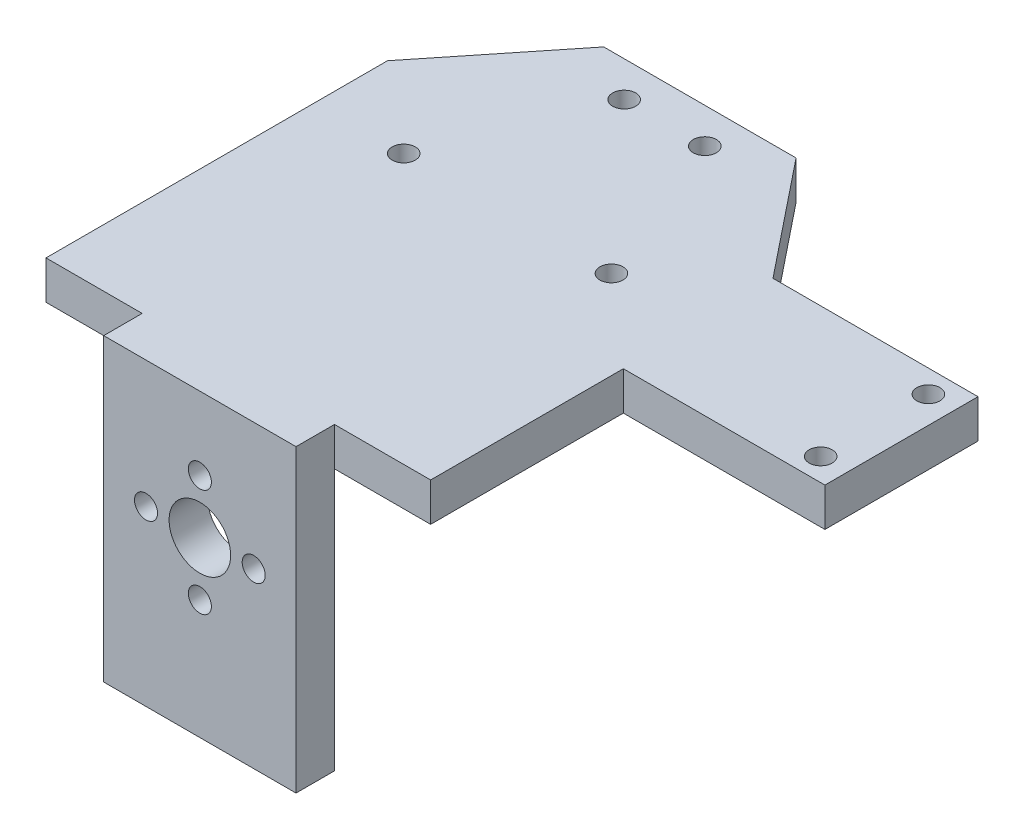
ISO-10303-21;
HEADER;
FILE_DESCRIPTION(('STEP AP214'),'2;1');
FILE_NAME('part.step','',(''),(''),'','','');
FILE_SCHEMA(('AUTOMOTIVE_DESIGN { 1 0 10303 214 1 1 1 1 }'));
ENDSEC;
DATA;
#1=APPLICATION_CONTEXT('core data for automotive mechanical design processes');
#2=APPLICATION_PROTOCOL_DEFINITION('international standard','automotive_design',2000,#1);
#3=PRODUCT_CONTEXT('',#1,'mechanical');
#4=PRODUCT('Part','Part','',(#3));
#5=PRODUCT_RELATED_PRODUCT_CATEGORY('part','',(#4));
#6=PRODUCT_DEFINITION_FORMATION('','',#4);
#7=PRODUCT_DEFINITION_CONTEXT('part definition',#1,'design');
#8=PRODUCT_DEFINITION('design','',#6,#7);
#9=PRODUCT_DEFINITION_SHAPE('','',#8);
#10=(LENGTH_UNIT() NAMED_UNIT(*) SI_UNIT(.MILLI.,.METRE.));
#11=(NAMED_UNIT(*) PLANE_ANGLE_UNIT() SI_UNIT($,.RADIAN.));
#12=(NAMED_UNIT(*) SI_UNIT($,.STERADIAN.) SOLID_ANGLE_UNIT());
#13=UNCERTAINTY_MEASURE_WITH_UNIT(LENGTH_MEASURE(1.E-05),#10,'distance_accuracy_value','');
#14=(GEOMETRIC_REPRESENTATION_CONTEXT(3) GLOBAL_UNCERTAINTY_ASSIGNED_CONTEXT((#13)) GLOBAL_UNIT_ASSIGNED_CONTEXT((#10,
#11,#12)) REPRESENTATION_CONTEXT('',''));
#15=CARTESIAN_POINT('',(0.,0.,0.));
#16=DIRECTION('',(0.,0.,1.));
#17=DIRECTION('',(1.,0.,0.));
#18=AXIS2_PLACEMENT_3D('',#15,#16,#17);
#19=CARTESIAN_POINT('',(0.,5.,30.));
#20=DIRECTION('',(0.,0.,-1.));
#21=DIRECTION('',(-1.,0.,0.));
#22=AXIS2_PLACEMENT_3D('',#19,#20,#21);
#23=PLANE('',#22);
#24=DIRECTION('',(1.,0.,0.));
#25=VECTOR('',#24,1.);
#26=CARTESIAN_POINT('',(0.,5.,30.));
#27=LINE('',#26,#25);
#28=CARTESIAN_POINT('',(12.5,5.,30.));
#29=VERTEX_POINT('',#28);
#30=CARTESIAN_POINT('',(25.,5.,30.));
#31=VERTEX_POINT('',#30);
#32=EDGE_CURVE('E128',#29,#31,#27,.T.);
#33=ORIENTED_EDGE('',*,*,#32,.F.);
#34=DIRECTION('',(0.,-1.,0.));
#35=VECTOR('',#34,1.);
#36=CARTESIAN_POINT('',(12.5,0.,30.));
#37=LINE('',#36,#35);
#38=CARTESIAN_POINT('',(12.5,0.,30.));
#39=VERTEX_POINT('',#38);
#40=EDGE_CURVE('E234',#29,#39,#37,.T.);
#41=ORIENTED_EDGE('',*,*,#40,.T.);
#42=DIRECTION('',(1.,0.,0.));
#43=VECTOR('',#42,1.);
#44=CARTESIAN_POINT('',(0.,0.,30.));
#45=LINE('',#44,#43);
#46=CARTESIAN_POINT('',(25.,0.,30.));
#47=VERTEX_POINT('',#46);
#48=EDGE_CURVE('E166',#39,#47,#45,.T.);
#49=ORIENTED_EDGE('',*,*,#48,.T.);
#50=DIRECTION('',(0.,-1.,0.));
#51=VECTOR('',#50,1.);
#52=CARTESIAN_POINT('',(25.,5.,30.));
#53=LINE('',#52,#51);
#54=EDGE_CURVE('E143',#31,#47,#53,.T.);
#55=ORIENTED_EDGE('',*,*,#54,.F.);
#56=EDGE_LOOP('',(#33,#41,#49,#55));
#57=FACE_BOUND('',#56,.T.);
#58=ADVANCED_FACE('F40',(#57),#23,.F.);
#59=CARTESIAN_POINT('',(22.2539015587463,5.,-17.8173808578109));
#60=DIRECTION('',(0.7806247497998,0.,-0.625));
#61=DIRECTION('',(-0.625,0.,-0.7806247497998));
#62=AXIS2_PLACEMENT_3D('',#59,#60,#61);
#63=PLANE('',#62);
#64=DIRECTION('',(0.,1.,0.));
#65=VECTOR('',#64,1.);
#66=CARTESIAN_POINT('',(24.5496435738328,0.,-14.95));
#67=LINE('',#66,#65);
#68=CARTESIAN_POINT('',(24.5496435738328,0.,-14.95));
#69=VERTEX_POINT('',#68);
#70=CARTESIAN_POINT('',(24.5496435738328,5.,-14.95));
#71=VERTEX_POINT('',#70);
#72=EDGE_CURVE('E181',#69,#71,#67,.T.);
#73=ORIENTED_EDGE('',*,*,#72,.F.);
#74=DIRECTION('',(0.625,0.,0.7806247497998));
#75=VECTOR('',#74,1.);
#76=CARTESIAN_POINT('',(22.2539015587463,0.,-17.8173808578109));
#77=LINE('',#76,#75);
#78=CARTESIAN_POINT('',(12.5,0.,-30.));
#79=VERTEX_POINT('',#78);
#80=EDGE_CURVE('E157',#79,#69,#77,.T.);
#81=ORIENTED_EDGE('',*,*,#80,.F.);
#82=DIRECTION('',(0.,-1.,0.));
#83=VECTOR('',#82,1.);
#84=CARTESIAN_POINT('',(12.5,5.,-30.));
#85=LINE('',#84,#83);
#86=CARTESIAN_POINT('',(12.5,5.,-30.));
#87=VERTEX_POINT('',#86);
#88=EDGE_CURVE('E44',#87,#79,#85,.T.);
#89=ORIENTED_EDGE('',*,*,#88,.F.);
#90=DIRECTION('',(0.625,0.,0.7806247497998));
#91=VECTOR('',#90,1.);
#92=CARTESIAN_POINT('',(22.2539015587463,5.,-17.8173808578109));
#93=LINE('',#92,#91);
#94=EDGE_CURVE('E136',#87,#71,#93,.T.);
#95=ORIENTED_EDGE('',*,*,#94,.T.);
#96=EDGE_LOOP('',(#73,#81,#89,#95));
#97=FACE_BOUND('',#96,.T.);
#98=ADVANCED_FACE('F178',(#97),#63,.T.);
#99=CARTESIAN_POINT('',(0.,5.,-30.));
#100=DIRECTION('',(0.,0.,-1.));
#101=DIRECTION('',(-1.,0.,0.));
#102=AXIS2_PLACEMENT_3D('',#99,#100,#101);
#103=PLANE('',#102);
#104=DIRECTION('',(1.,0.,0.));
#105=VECTOR('',#104,1.);
#106=CARTESIAN_POINT('',(0.,0.,-30.));
#107=LINE('',#106,#105);
#108=CARTESIAN_POINT('',(-12.5,0.,-30.));
#109=VERTEX_POINT('',#108);
#110=EDGE_CURVE('E160',#109,#79,#107,.T.);
#111=ORIENTED_EDGE('',*,*,#110,.F.);
#112=DIRECTION('',(0.,-1.,0.));
#113=VECTOR('',#112,1.);
#114=CARTESIAN_POINT('',(-12.5,5.,-30.));
#115=LINE('',#114,#113);
#116=CARTESIAN_POINT('',(-12.5,5.,-30.));
#117=VERTEX_POINT('',#116);
#118=EDGE_CURVE('E118',#117,#109,#115,.T.);
#119=ORIENTED_EDGE('',*,*,#118,.F.);
#120=DIRECTION('',(1.,0.,0.));
#121=VECTOR('',#120,1.);
#122=CARTESIAN_POINT('',(0.,5.,-30.));
#123=LINE('',#122,#121);
#124=EDGE_CURVE('E134',#117,#87,#123,.T.);
#125=ORIENTED_EDGE('',*,*,#124,.T.);
#126=ORIENTED_EDGE('',*,*,#88,.T.);
#127=EDGE_LOOP('',(#111,#119,#125,#126));
#128=FACE_BOUND('',#127,.T.);
#129=ADVANCED_FACE('F176',(#128),#103,.T.);
#130=CARTESIAN_POINT('',(-22.2539015587463,5.,-17.8173808578109));
#131=DIRECTION('',(-0.7806247497998,0.,-0.625));
#132=DIRECTION('',(-0.625,0.,0.7806247497998));
#133=AXIS2_PLACEMENT_3D('',#130,#131,#132);
#134=PLANE('',#133);
#135=DIRECTION('',(0.625,0.,-0.7806247497998));
#136=VECTOR('',#135,1.);
#137=CARTESIAN_POINT('',(-22.2539015587463,0.,-17.8173808578109));
#138=LINE('',#137,#136);
#139=CARTESIAN_POINT('',(-25.,0.,-14.387505004004));
#140=VERTEX_POINT('',#139);
#141=EDGE_CURVE('E114',#140,#109,#138,.T.);
#142=ORIENTED_EDGE('',*,*,#141,.F.);
#143=DIRECTION('',(0.,-1.,0.));
#144=VECTOR('',#143,1.);
#145=CARTESIAN_POINT('',(-25.,5.,-14.387505004004));
#146=LINE('',#145,#144);
#147=CARTESIAN_POINT('',(-25.,5.,-14.387505004004));
#148=VERTEX_POINT('',#147);
#149=EDGE_CURVE('E108',#148,#140,#146,.T.);
#150=ORIENTED_EDGE('',*,*,#149,.F.);
#151=DIRECTION('',(0.625,0.,-0.7806247497998));
#152=VECTOR('',#151,1.);
#153=CARTESIAN_POINT('',(-22.2539015587463,5.,-17.8173808578109));
#154=LINE('',#153,#152);
#155=EDGE_CURVE('E112',#148,#117,#154,.T.);
#156=ORIENTED_EDGE('',*,*,#155,.T.);
#157=ORIENTED_EDGE('',*,*,#118,.T.);
#158=EDGE_LOOP('',(#142,#150,#156,#157));
#159=FACE_BOUND('',#158,.T.);
#160=ADVANCED_FACE('F110',(#159),#134,.T.);
#161=CARTESIAN_POINT('',(-25.,5.,0.));
#162=DIRECTION('',(1.,0.,0.));
#163=DIRECTION('',(0.,0.,-1.));
#164=AXIS2_PLACEMENT_3D('',#161,#162,#163);
#165=PLANE('',#164);
#166=DIRECTION('',(0.,0.,1.));
#167=VECTOR('',#166,1.);
#168=CARTESIAN_POINT('',(-25.,0.,0.));
#169=LINE('',#168,#167);
#170=CARTESIAN_POINT('',(-25.,0.,30.));
#171=VERTEX_POINT('',#170);
#172=EDGE_CURVE('E164',#140,#171,#169,.T.);
#173=ORIENTED_EDGE('',*,*,#172,.T.);
#174=DIRECTION('',(0.,-1.,0.));
#175=VECTOR('',#174,1.);
#176=CARTESIAN_POINT('',(-25.,5.,30.));
#177=LINE('',#176,#175);
#178=CARTESIAN_POINT('',(-25.,5.,30.));
#179=VERTEX_POINT('',#178);
#180=EDGE_CURVE('E119',#179,#171,#177,.T.);
#181=ORIENTED_EDGE('',*,*,#180,.F.);
#182=DIRECTION('',(0.,0.,1.));
#183=VECTOR('',#182,1.);
#184=CARTESIAN_POINT('',(-25.,5.,0.));
#185=LINE('',#184,#183);
#186=EDGE_CURVE('E123',#148,#179,#185,.T.);
#187=ORIENTED_EDGE('',*,*,#186,.F.);
#188=ORIENTED_EDGE('',*,*,#149,.T.);
#189=EDGE_LOOP('',(#173,#181,#187,#188));
#190=FACE_BOUND('',#189,.T.);
#191=ADVANCED_FACE('F124',(#190),#165,.F.);
#192=CARTESIAN_POINT('',(-12.5,0.,30.));
#193=VERTEX_POINT('',#192);
#194=EDGE_CURVE('E167',#171,#193,#45,.T.);
#195=ORIENTED_EDGE('',*,*,#194,.T.);
#196=DIRECTION('',(0.,1.,0.));
#197=VECTOR('',#196,1.);
#198=CARTESIAN_POINT('',(-12.5,0.,30.));
#199=LINE('',#198,#197);
#200=CARTESIAN_POINT('',(-12.5,5.,30.));
#201=VERTEX_POINT('',#200);
#202=EDGE_CURVE('E11',#193,#201,#199,.T.);
#203=ORIENTED_EDGE('',*,*,#202,.T.);
#204=EDGE_CURVE('E140',#179,#201,#27,.T.);
#205=ORIENTED_EDGE('',*,*,#204,.F.);
#206=ORIENTED_EDGE('',*,*,#180,.T.);
#207=EDGE_LOOP('',(#195,#203,#205,#206));
#208=FACE_BOUND('',#207,.T.);
#209=ADVANCED_FACE('F188',(#208),#23,.F.);
#210=CARTESIAN_POINT('',(-13.5,5.,-5.00000000000001));
#211=DIRECTION('',(0.,-1.,0.));
#212=DIRECTION('',(0.,0.,-1.));
#213=AXIS2_PLACEMENT_3D('',#210,#211,#212);
#214=CYLINDRICAL_SURFACE('',#213,1.5);
#215=CARTESIAN_POINT('',(-13.5,5.,-5.00000000000001));
#216=DIRECTION('',(0.,1.,0.));
#217=DIRECTION('',(0.,0.,1.));
#218=AXIS2_PLACEMENT_3D('',#215,#216,#217);
#219=CIRCLE('',#218,1.5);
#220=CARTESIAN_POINT('',(-13.5,5.,-3.50000000000001));
#221=VERTEX_POINT('',#220);
#222=EDGE_CURVE('E254',#221,#221,#219,.T.);
#223=ORIENTED_EDGE('',*,*,#222,.T.);
#224=EDGE_LOOP('',(#223));
#225=FACE_BOUND('',#224,.T.);
#226=CARTESIAN_POINT('',(-13.5,0.,-5.00000000000001));
#227=DIRECTION('',(0.,1.,0.));
#228=DIRECTION('',(0.,0.,1.));
#229=AXIS2_PLACEMENT_3D('',#226,#227,#228);
#230=CIRCLE('',#229,1.5);
#231=CARTESIAN_POINT('',(-13.5,0.,-3.50000000000001));
#232=VERTEX_POINT('',#231);
#233=EDGE_CURVE('E154',#232,#232,#230,.T.);
#234=ORIENTED_EDGE('',*,*,#233,.F.);
#235=EDGE_LOOP('',(#234));
#236=FACE_BOUND('',#235,.T.);
#237=ADVANCED_FACE('F357',(#225,#236),#214,.F.);
#238=CARTESIAN_POINT('',(13.5,5.,-5.00000000000002));
#239=DIRECTION('',(0.,-1.,0.));
#240=DIRECTION('',(0.,0.,-1.));
#241=AXIS2_PLACEMENT_3D('',#238,#239,#240);
#242=CYLINDRICAL_SURFACE('',#241,1.5);
#243=CARTESIAN_POINT('',(13.5,5.,-5.00000000000002));
#244=DIRECTION('',(0.,1.,0.));
#245=DIRECTION('',(0.,0.,1.));
#246=AXIS2_PLACEMENT_3D('',#243,#244,#245);
#247=CIRCLE('',#246,1.5);
#248=CARTESIAN_POINT('',(13.5,5.,-3.50000000000001));
#249=VERTEX_POINT('',#248);
#250=EDGE_CURVE('E251',#249,#249,#247,.T.);
#251=ORIENTED_EDGE('',*,*,#250,.T.);
#252=EDGE_LOOP('',(#251));
#253=FACE_BOUND('',#252,.T.);
#254=CARTESIAN_POINT('',(13.5,0.,-5.00000000000002));
#255=DIRECTION('',(0.,1.,0.));
#256=DIRECTION('',(0.,0.,1.));
#257=AXIS2_PLACEMENT_3D('',#254,#255,#256);
#258=CIRCLE('',#257,1.5);
#259=CARTESIAN_POINT('',(13.5,0.,-3.50000000000001));
#260=VERTEX_POINT('',#259);
#261=EDGE_CURVE('E151',#260,#260,#258,.T.);
#262=ORIENTED_EDGE('',*,*,#261,.F.);
#263=EDGE_LOOP('',(#262));
#264=FACE_BOUND('',#263,.T.);
#265=ADVANCED_FACE('F362',(#253,#264),#242,.F.);
#266=CARTESIAN_POINT('',(-5.24,5.,-25.4));
#267=DIRECTION('',(0.,-1.,0.));
#268=DIRECTION('',(0.,0.,-1.));
#269=AXIS2_PLACEMENT_3D('',#266,#267,#268);
#270=CYLINDRICAL_SURFACE('',#269,1.5);
#271=CARTESIAN_POINT('',(-5.24,5.,-25.4));
#272=DIRECTION('',(0.,1.,0.));
#273=DIRECTION('',(0.,0.,1.));
#274=AXIS2_PLACEMENT_3D('',#271,#272,#273);
#275=CIRCLE('',#274,1.5);
#276=CARTESIAN_POINT('',(-5.24,5.,-23.9));
#277=VERTEX_POINT('',#276);
#278=EDGE_CURVE('E248',#277,#277,#275,.T.);
#279=ORIENTED_EDGE('',*,*,#278,.T.);
#280=EDGE_LOOP('',(#279));
#281=FACE_BOUND('',#280,.T.);
#282=CARTESIAN_POINT('',(-5.24,0.,-25.4));
#283=DIRECTION('',(0.,1.,0.));
#284=DIRECTION('',(0.,0.,1.));
#285=AXIS2_PLACEMENT_3D('',#282,#283,#284);
#286=CIRCLE('',#285,1.5);
#287=CARTESIAN_POINT('',(-5.24,0.,-23.9));
#288=VERTEX_POINT('',#287);
#289=EDGE_CURVE('E147',#288,#288,#286,.T.);
#290=ORIENTED_EDGE('',*,*,#289,.F.);
#291=EDGE_LOOP('',(#290));
#292=FACE_BOUND('',#291,.T.);
#293=ADVANCED_FACE('F373',(#281,#292),#270,.F.);
#294=CARTESIAN_POINT('',(5.24,5.,-25.4));
#295=DIRECTION('',(0.,-1.,0.));
#296=DIRECTION('',(0.,0.,-1.));
#297=AXIS2_PLACEMENT_3D('',#294,#295,#296);
#298=CYLINDRICAL_SURFACE('',#297,1.5);
#299=CARTESIAN_POINT('',(5.24,5.,-25.4));
#300=DIRECTION('',(0.,1.,0.));
#301=DIRECTION('',(0.,0.,1.));
#302=AXIS2_PLACEMENT_3D('',#299,#300,#301);
#303=CIRCLE('',#302,1.5);
#304=CARTESIAN_POINT('',(5.24,5.,-23.9));
#305=VERTEX_POINT('',#304);
#306=EDGE_CURVE('E172',#305,#305,#303,.T.);
#307=ORIENTED_EDGE('',*,*,#306,.T.);
#308=EDGE_LOOP('',(#307));
#309=FACE_BOUND('',#308,.T.);
#310=CARTESIAN_POINT('',(5.24,0.,-25.4));
#311=DIRECTION('',(0.,1.,0.));
#312=DIRECTION('',(0.,0.,1.));
#313=AXIS2_PLACEMENT_3D('',#310,#311,#312);
#314=CIRCLE('',#313,1.5);
#315=CARTESIAN_POINT('',(5.24,0.,-23.9));
#316=VERTEX_POINT('',#315);
#317=EDGE_CURVE('E144',#316,#316,#314,.T.);
#318=ORIENTED_EDGE('',*,*,#317,.F.);
#319=EDGE_LOOP('',(#318));
#320=FACE_BOUND('',#319,.T.);
#321=ADVANCED_FACE('F42',(#309,#320),#298,.F.);
#322=CARTESIAN_POINT('',(25.,5.,0.));
#323=DIRECTION('',(1.,0.,0.));
#324=DIRECTION('',(0.,0.,-1.));
#325=AXIS2_PLACEMENT_3D('',#322,#323,#324);
#326=PLANE('',#325);
#327=DIRECTION('',(0.,1.,0.));
#328=VECTOR('',#327,1.);
#329=CARTESIAN_POINT('',(25.,0.,4.94999999999999));
#330=LINE('',#329,#328);
#331=CARTESIAN_POINT('',(25.,0.,4.94999999999999));
#332=VERTEX_POINT('',#331);
#333=CARTESIAN_POINT('',(25.,5.,4.94999999999999));
#334=VERTEX_POINT('',#333);
#335=EDGE_CURVE('E287',#332,#334,#330,.T.);
#336=ORIENTED_EDGE('',*,*,#335,.T.);
#337=DIRECTION('',(0.,0.,1.));
#338=VECTOR('',#337,1.);
#339=CARTESIAN_POINT('',(25.,5.,0.));
#340=LINE('',#339,#338);
#341=EDGE_CURVE('E65',#334,#31,#340,.T.);
#342=ORIENTED_EDGE('',*,*,#341,.T.);
#343=ORIENTED_EDGE('',*,*,#54,.T.);
#344=DIRECTION('',(0.,0.,1.));
#345=VECTOR('',#344,1.);
#346=CARTESIAN_POINT('',(25.,0.,0.));
#347=LINE('',#346,#345);
#348=EDGE_CURVE('E91',#332,#47,#347,.T.);
#349=ORIENTED_EDGE('',*,*,#348,.F.);
#350=EDGE_LOOP('',(#336,#342,#343,#349));
#351=FACE_BOUND('',#350,.T.);
#352=ADVANCED_FACE('F380',(#351),#326,.T.);
#353=CARTESIAN_POINT('',(0.,5.,0.));
#354=DIRECTION('',(0.,1.,0.));
#355=DIRECTION('',(0.,0.,1.));
#356=AXIS2_PLACEMENT_3D('',#353,#354,#355);
#357=PLANE('',#356);
#358=ORIENTED_EDGE('',*,*,#341,.F.);
#359=DIRECTION('',(1.,0.,0.));
#360=VECTOR('',#359,1.);
#361=CARTESIAN_POINT('',(51.2,5.,4.94999999999998));
#362=LINE('',#361,#360);
#363=CARTESIAN_POINT('',(51.2,5.,4.94999999999998));
#364=VERTEX_POINT('',#363);
#365=EDGE_CURVE('E269',#334,#364,#362,.T.);
#366=ORIENTED_EDGE('',*,*,#365,.T.);
#367=DIRECTION('',(0.,0.,-1.));
#368=VECTOR('',#367,1.);
#369=CARTESIAN_POINT('',(51.2,5.,-14.95));
#370=LINE('',#369,#368);
#371=CARTESIAN_POINT('',(51.2,5.,-14.95));
#372=VERTEX_POINT('',#371);
#373=EDGE_CURVE('E266',#364,#372,#370,.T.);
#374=ORIENTED_EDGE('',*,*,#373,.T.);
#375=DIRECTION('',(-1.,0.,0.));
#376=VECTOR('',#375,1.);
#377=CARTESIAN_POINT('',(51.2,5.,-14.95));
#378=LINE('',#377,#376);
#379=EDGE_CURVE('E262',#372,#71,#378,.T.);
#380=ORIENTED_EDGE('',*,*,#379,.T.);
#381=ORIENTED_EDGE('',*,*,#94,.F.);
#382=ORIENTED_EDGE('',*,*,#124,.F.);
#383=ORIENTED_EDGE('',*,*,#155,.F.);
#384=ORIENTED_EDGE('',*,*,#186,.T.);
#385=ORIENTED_EDGE('',*,*,#204,.T.);
#386=DIRECTION('',(0.,0.,-1.));
#387=VECTOR('',#386,1.);
#388=CARTESIAN_POINT('',(-12.5,5.,35.));
#389=LINE('',#388,#387);
#390=CARTESIAN_POINT('',(-12.5,5.,35.));
#391=VERTEX_POINT('',#390);
#392=EDGE_CURVE('E57',#391,#201,#389,.T.);
#393=ORIENTED_EDGE('',*,*,#392,.F.);
#394=DIRECTION('',(-1.,0.,0.));
#395=VECTOR('',#394,1.);
#396=CARTESIAN_POINT('',(0.,5.,35.));
#397=LINE('',#396,#395);
#398=CARTESIAN_POINT('',(12.5,5.,35.));
#399=VERTEX_POINT('',#398);
#400=EDGE_CURVE('E194',#399,#391,#397,.T.);
#401=ORIENTED_EDGE('',*,*,#400,.F.);
#402=DIRECTION('',(0.,0.,-1.));
#403=VECTOR('',#402,1.);
#404=CARTESIAN_POINT('',(12.5,5.,35.));
#405=LINE('',#404,#403);
#406=EDGE_CURVE('E148',#399,#29,#405,.T.);
#407=ORIENTED_EDGE('',*,*,#406,.T.);
#408=ORIENTED_EDGE('',*,*,#32,.T.);
#409=EDGE_LOOP('',(#358,#366,#374,#380,#381,#382,#383,#384,#385,#393,#401,#407,#408));
#410=FACE_BOUND('',#409,.T.);
#411=ORIENTED_EDGE('',*,*,#306,.F.);
#412=EDGE_LOOP('',(#411));
#413=FACE_BOUND('',#412,.T.);
#414=ORIENTED_EDGE('',*,*,#278,.F.);
#415=EDGE_LOOP('',(#414));
#416=FACE_BOUND('',#415,.T.);
#417=ORIENTED_EDGE('',*,*,#250,.F.);
#418=EDGE_LOOP('',(#417));
#419=FACE_BOUND('',#418,.T.);
#420=ORIENTED_EDGE('',*,*,#222,.F.);
#421=EDGE_LOOP('',(#420));
#422=FACE_BOUND('',#421,.T.);
#423=CARTESIAN_POINT('',(47.7,5.,-12.));
#424=DIRECTION('',(0.,1.,0.));
#425=DIRECTION('',(0.,0.,-1.));
#426=AXIS2_PLACEMENT_3D('',#423,#424,#425);
#427=CIRCLE('',#426,1.5);
#428=CARTESIAN_POINT('',(47.7,5.,-13.5));
#429=VERTEX_POINT('',#428);
#430=EDGE_CURVE('E409',#429,#429,#427,.T.);
#431=ORIENTED_EDGE('',*,*,#430,.F.);
#432=EDGE_LOOP('',(#431));
#433=FACE_BOUND('',#432,.T.);
#434=CARTESIAN_POINT('',(47.7,5.,1.99999999999998));
#435=DIRECTION('',(0.,1.,0.));
#436=DIRECTION('',(0.,0.,1.));
#437=AXIS2_PLACEMENT_3D('',#434,#435,#436);
#438=CIRCLE('',#437,1.5);
#439=CARTESIAN_POINT('',(47.7,5.,3.49999999999998));
#440=VERTEX_POINT('',#439);
#441=EDGE_CURVE('E274',#440,#440,#438,.T.);
#442=ORIENTED_EDGE('',*,*,#441,.F.);
#443=EDGE_LOOP('',(#442));
#444=FACE_BOUND('',#443,.T.);
#445=ADVANCED_FACE('F131',(#410,#413,#416,#419,#422,#433,#444),#357,.T.);
#446=CARTESIAN_POINT('',(0.,0.,0.));
#447=DIRECTION('',(0.,1.,0.));
#448=DIRECTION('',(0.,0.,1.));
#449=AXIS2_PLACEMENT_3D('',#446,#447,#448);
#450=PLANE('',#449);
#451=DIRECTION('',(1.,0.,0.));
#452=VECTOR('',#451,1.);
#453=CARTESIAN_POINT('',(51.2,0.,4.94999999999998));
#454=LINE('',#453,#452);
#455=CARTESIAN_POINT('',(51.2,0.,4.94999999999998));
#456=VERTEX_POINT('',#455);
#457=EDGE_CURVE('E414',#332,#456,#454,.T.);
#458=ORIENTED_EDGE('',*,*,#457,.F.);
#459=ORIENTED_EDGE('',*,*,#348,.T.);
#460=ORIENTED_EDGE('',*,*,#48,.F.);
#461=EDGE_CURVE('E170',#193,#39,#45,.T.);
#462=ORIENTED_EDGE('',*,*,#461,.F.);
#463=ORIENTED_EDGE('',*,*,#194,.F.);
#464=ORIENTED_EDGE('',*,*,#172,.F.);
#465=ORIENTED_EDGE('',*,*,#141,.T.);
#466=ORIENTED_EDGE('',*,*,#110,.T.);
#467=ORIENTED_EDGE('',*,*,#80,.T.);
#468=DIRECTION('',(-1.,0.,0.));
#469=VECTOR('',#468,1.);
#470=CARTESIAN_POINT('',(51.2,0.,-14.95));
#471=LINE('',#470,#469);
#472=CARTESIAN_POINT('',(51.2,0.,-14.95));
#473=VERTEX_POINT('',#472);
#474=EDGE_CURVE('E281',#473,#69,#471,.T.);
#475=ORIENTED_EDGE('',*,*,#474,.F.);
#476=DIRECTION('',(0.,0.,-1.));
#477=VECTOR('',#476,1.);
#478=CARTESIAN_POINT('',(51.2,0.,-14.95));
#479=LINE('',#478,#477);
#480=EDGE_CURVE('E277',#456,#473,#479,.T.);
#481=ORIENTED_EDGE('',*,*,#480,.F.);
#482=EDGE_LOOP('',(#458,#459,#460,#462,#463,#464,#465,#466,#467,#475,#481));
#483=FACE_BOUND('',#482,.T.);
#484=ORIENTED_EDGE('',*,*,#317,.T.);
#485=EDGE_LOOP('',(#484));
#486=FACE_BOUND('',#485,.T.);
#487=ORIENTED_EDGE('',*,*,#289,.T.);
#488=EDGE_LOOP('',(#487));
#489=FACE_BOUND('',#488,.T.);
#490=ORIENTED_EDGE('',*,*,#261,.T.);
#491=EDGE_LOOP('',(#490));
#492=FACE_BOUND('',#491,.T.);
#493=ORIENTED_EDGE('',*,*,#233,.T.);
#494=EDGE_LOOP('',(#493));
#495=FACE_BOUND('',#494,.T.);
#496=CARTESIAN_POINT('',(47.7,0.,-12.));
#497=DIRECTION('',(0.,1.,0.));
#498=DIRECTION('',(0.,0.,-1.));
#499=AXIS2_PLACEMENT_3D('',#496,#497,#498);
#500=CIRCLE('',#499,1.5);
#501=CARTESIAN_POINT('',(47.7,0.,-13.5));
#502=VERTEX_POINT('',#501);
#503=EDGE_CURVE('E396',#502,#502,#500,.T.);
#504=ORIENTED_EDGE('',*,*,#503,.T.);
#505=EDGE_LOOP('',(#504));
#506=FACE_BOUND('',#505,.T.);
#507=CARTESIAN_POINT('',(47.7,0.,1.99999999999998));
#508=DIRECTION('',(0.,1.,0.));
#509=DIRECTION('',(0.,0.,1.));
#510=AXIS2_PLACEMENT_3D('',#507,#508,#509);
#511=CIRCLE('',#510,1.5);
#512=CARTESIAN_POINT('',(47.7,0.,3.49999999999998));
#513=VERTEX_POINT('',#512);
#514=EDGE_CURVE('E270',#513,#513,#511,.T.);
#515=ORIENTED_EDGE('',*,*,#514,.T.);
#516=EDGE_LOOP('',(#515));
#517=FACE_BOUND('',#516,.T.);
#518=ADVANCED_FACE('F183',(#483,#486,#489,#492,#495,#506,#517),#450,.F.);
#519=CARTESIAN_POINT('',(0.,0.,30.));
#520=DIRECTION('',(0.,0.,1.));
#521=DIRECTION('',(1.,0.,0.));
#522=AXIS2_PLACEMENT_3D('',#519,#520,#521);
#523=PLANE('',#522);
#524=CARTESIAN_POINT('',(-6.9999999999999,-11.5,30.));
#525=DIRECTION('',(0.,0.,1.));
#526=DIRECTION('',(1.,0.,0.));
#527=AXIS2_PLACEMENT_3D('',#524,#525,#526);
#528=CIRCLE('',#527,1.5);
#529=CARTESIAN_POINT('',(-5.4999999999999,-11.5,30.));
#530=VERTEX_POINT('',#529);
#531=EDGE_CURVE('E217',#530,#530,#528,.T.);
#532=ORIENTED_EDGE('',*,*,#531,.T.);
#533=EDGE_LOOP('',(#532));
#534=FACE_BOUND('',#533,.T.);
#535=CARTESIAN_POINT('',(1.5081679866602E-13,-18.5,30.));
#536=DIRECTION('',(0.,0.,1.));
#537=DIRECTION('',(1.,0.,0.));
#538=AXIS2_PLACEMENT_3D('',#535,#536,#537);
#539=CIRCLE('',#538,1.5);
#540=CARTESIAN_POINT('',(1.50000000000015,-18.5,30.));
#541=VERTEX_POINT('',#540);
#542=EDGE_CURVE('E220',#541,#541,#539,.T.);
#543=ORIENTED_EDGE('',*,*,#542,.T.);
#544=EDGE_LOOP('',(#543));
#545=FACE_BOUND('',#544,.T.);
#546=CARTESIAN_POINT('',(7.0000000000001,-11.4999999999999,30.));
#547=DIRECTION('',(0.,0.,1.));
#548=DIRECTION('',(1.,0.,0.));
#549=AXIS2_PLACEMENT_3D('',#546,#547,#548);
#550=CIRCLE('',#549,1.5);
#551=CARTESIAN_POINT('',(8.5000000000001,-11.4999999999999,30.));
#552=VERTEX_POINT('',#551);
#553=EDGE_CURVE('E224',#552,#552,#550,.T.);
#554=ORIENTED_EDGE('',*,*,#553,.T.);
#555=EDGE_LOOP('',(#554));
#556=FACE_BOUND('',#555,.T.);
#557=CARTESIAN_POINT('',(0.,-11.5,30.));
#558=DIRECTION('',(0.,0.,1.));
#559=DIRECTION('',(1.,0.,0.));
#560=AXIS2_PLACEMENT_3D('',#557,#558,#559);
#561=CIRCLE('',#560,4.);
#562=CARTESIAN_POINT('',(4.,-11.5,30.));
#563=VERTEX_POINT('',#562);
#564=EDGE_CURVE('E227',#563,#563,#561,.T.);
#565=ORIENTED_EDGE('',*,*,#564,.T.);
#566=EDGE_LOOP('',(#565));
#567=FACE_BOUND('',#566,.T.);
#568=CARTESIAN_POINT('',(0.,-4.5,30.));
#569=DIRECTION('',(0.,0.,1.));
#570=DIRECTION('',(1.,0.,0.));
#571=AXIS2_PLACEMENT_3D('',#568,#569,#570);
#572=CIRCLE('',#571,1.5);
#573=CARTESIAN_POINT('',(1.5,-4.5,30.));
#574=VERTEX_POINT('',#573);
#575=EDGE_CURVE('E230',#574,#574,#572,.T.);
#576=ORIENTED_EDGE('',*,*,#575,.T.);
#577=EDGE_LOOP('',(#576));
#578=FACE_BOUND('',#577,.T.);
#579=CARTESIAN_POINT('',(-12.5,-34.,30.));
#580=VERTEX_POINT('',#579);
#581=EDGE_CURVE('E50',#580,#193,#199,.T.);
#582=ORIENTED_EDGE('',*,*,#581,.T.);
#583=ORIENTED_EDGE('',*,*,#461,.T.);
#584=CARTESIAN_POINT('',(12.5,-34.,30.));
#585=VERTEX_POINT('',#584);
#586=EDGE_CURVE('E233',#39,#585,#37,.T.);
#587=ORIENTED_EDGE('',*,*,#586,.T.);
#588=DIRECTION('',(1.,0.,0.));
#589=VECTOR('',#588,1.);
#590=CARTESIAN_POINT('',(0.,-34.,30.));
#591=LINE('',#590,#589);
#592=EDGE_CURVE('E238',#580,#585,#591,.T.);
#593=ORIENTED_EDGE('',*,*,#592,.F.);
#594=EDGE_LOOP('',(#582,#583,#587,#593));
#595=FACE_BOUND('',#594,.T.);
#596=ADVANCED_FACE('F328',(#534,#545,#556,#567,#578,#595),#523,.F.);
#597=CARTESIAN_POINT('',(12.5,0.,35.));
#598=DIRECTION('',(1.,0.,0.));
#599=DIRECTION('',(0.,1.,0.));
#600=AXIS2_PLACEMENT_3D('',#597,#598,#599);
#601=PLANE('',#600);
#602=ORIENTED_EDGE('',*,*,#40,.F.);
#603=ORIENTED_EDGE('',*,*,#406,.F.);
#604=DIRECTION('',(0.,-1.,0.));
#605=VECTOR('',#604,1.);
#606=CARTESIAN_POINT('',(12.5,0.,35.));
#607=LINE('',#606,#605);
#608=CARTESIAN_POINT('',(12.5,-34.,35.));
#609=VERTEX_POINT('',#608);
#610=EDGE_CURVE('E213',#399,#609,#607,.T.);
#611=ORIENTED_EDGE('',*,*,#610,.T.);
#612=DIRECTION('',(0.,0.,-1.));
#613=VECTOR('',#612,1.);
#614=CARTESIAN_POINT('',(12.5,-34.,35.));
#615=LINE('',#614,#613);
#616=EDGE_CURVE('E211',#609,#585,#615,.T.);
#617=ORIENTED_EDGE('',*,*,#616,.T.);
#618=ORIENTED_EDGE('',*,*,#586,.F.);
#619=EDGE_LOOP('',(#602,#603,#611,#617,#618));
#620=FACE_BOUND('',#619,.T.);
#621=ADVANCED_FACE('F308',(#620),#601,.T.);
#622=CARTESIAN_POINT('',(-12.5,0.,35.));
#623=DIRECTION('',(-1.,0.,0.));
#624=DIRECTION('',(0.,-1.,0.));
#625=AXIS2_PLACEMENT_3D('',#622,#623,#624);
#626=PLANE('',#625);
#627=ORIENTED_EDGE('',*,*,#581,.F.);
#628=DIRECTION('',(0.,0.,-1.));
#629=VECTOR('',#628,1.);
#630=CARTESIAN_POINT('',(-12.5,-34.,35.));
#631=LINE('',#630,#629);
#632=CARTESIAN_POINT('',(-12.5,-34.,35.));
#633=VERTEX_POINT('',#632);
#634=EDGE_CURVE('E198',#633,#580,#631,.T.);
#635=ORIENTED_EDGE('',*,*,#634,.F.);
#636=DIRECTION('',(0.,1.,0.));
#637=VECTOR('',#636,1.);
#638=CARTESIAN_POINT('',(-12.5,0.,35.));
#639=LINE('',#638,#637);
#640=EDGE_CURVE('E202',#633,#391,#639,.T.);
#641=ORIENTED_EDGE('',*,*,#640,.T.);
#642=ORIENTED_EDGE('',*,*,#392,.T.);
#643=ORIENTED_EDGE('',*,*,#202,.F.);
#644=EDGE_LOOP('',(#627,#635,#641,#642,#643));
#645=FACE_BOUND('',#644,.T.);
#646=ADVANCED_FACE('F204',(#645),#626,.T.);
#647=CARTESIAN_POINT('',(0.,-4.5,35.));
#648=DIRECTION('',(0.,0.,-1.));
#649=DIRECTION('',(-1.,0.,0.));
#650=AXIS2_PLACEMENT_3D('',#647,#648,#649);
#651=CYLINDRICAL_SURFACE('',#650,1.5);
#652=CARTESIAN_POINT('',(0.,-4.5,35.));
#653=DIRECTION('',(0.,0.,1.));
#654=DIRECTION('',(1.,0.,0.));
#655=AXIS2_PLACEMENT_3D('',#652,#653,#654);
#656=CIRCLE('',#655,1.5);
#657=CARTESIAN_POINT('',(1.5,-4.5,35.));
#658=VERTEX_POINT('',#657);
#659=EDGE_CURVE('E301',#658,#658,#656,.T.);
#660=ORIENTED_EDGE('',*,*,#659,.T.);
#661=EDGE_LOOP('',(#660));
#662=FACE_BOUND('',#661,.T.);
#663=ORIENTED_EDGE('',*,*,#575,.F.);
#664=EDGE_LOOP('',(#663));
#665=FACE_BOUND('',#664,.T.);
#666=ADVANCED_FACE('F455',(#662,#665),#651,.F.);
#667=CARTESIAN_POINT('',(0.,-11.5,35.));
#668=DIRECTION('',(0.,0.,-1.));
#669=DIRECTION('',(-1.,0.,0.));
#670=AXIS2_PLACEMENT_3D('',#667,#668,#669);
#671=CYLINDRICAL_SURFACE('',#670,4.);
#672=CARTESIAN_POINT('',(0.,-11.5,35.));
#673=DIRECTION('',(0.,0.,1.));
#674=DIRECTION('',(1.,0.,0.));
#675=AXIS2_PLACEMENT_3D('',#672,#673,#674);
#676=CIRCLE('',#675,4.);
#677=CARTESIAN_POINT('',(4.,-11.5,35.));
#678=VERTEX_POINT('',#677);
#679=EDGE_CURVE('E298',#678,#678,#676,.T.);
#680=ORIENTED_EDGE('',*,*,#679,.T.);
#681=EDGE_LOOP('',(#680));
#682=FACE_BOUND('',#681,.T.);
#683=ORIENTED_EDGE('',*,*,#564,.F.);
#684=EDGE_LOOP('',(#683));
#685=FACE_BOUND('',#684,.T.);
#686=ADVANCED_FACE('F457',(#682,#685),#671,.F.);
#687=CARTESIAN_POINT('',(7.0000000000001,-11.4999999999999,35.));
#688=DIRECTION('',(0.,0.,-1.));
#689=DIRECTION('',(-1.,0.,0.));
#690=AXIS2_PLACEMENT_3D('',#687,#688,#689);
#691=CYLINDRICAL_SURFACE('',#690,1.5);
#692=CARTESIAN_POINT('',(7.0000000000001,-11.4999999999999,35.));
#693=DIRECTION('',(0.,0.,1.));
#694=DIRECTION('',(1.,0.,0.));
#695=AXIS2_PLACEMENT_3D('',#692,#693,#694);
#696=CIRCLE('',#695,1.5);
#697=CARTESIAN_POINT('',(8.5000000000001,-11.4999999999999,35.));
#698=VERTEX_POINT('',#697);
#699=EDGE_CURVE('E295',#698,#698,#696,.T.);
#700=ORIENTED_EDGE('',*,*,#699,.T.);
#701=EDGE_LOOP('',(#700));
#702=FACE_BOUND('',#701,.T.);
#703=ORIENTED_EDGE('',*,*,#553,.F.);
#704=EDGE_LOOP('',(#703));
#705=FACE_BOUND('',#704,.T.);
#706=ADVANCED_FACE('F464',(#702,#705),#691,.F.);
#707=CARTESIAN_POINT('',(1.5081679866602E-13,-18.5,35.));
#708=DIRECTION('',(0.,0.,-1.));
#709=DIRECTION('',(-1.,0.,0.));
#710=AXIS2_PLACEMENT_3D('',#707,#708,#709);
#711=CYLINDRICAL_SURFACE('',#710,1.5);
#712=CARTESIAN_POINT('',(1.5081679866602E-13,-18.5,35.));
#713=DIRECTION('',(0.,0.,1.));
#714=DIRECTION('',(1.,0.,0.));
#715=AXIS2_PLACEMENT_3D('',#712,#713,#714);
#716=CIRCLE('',#715,1.5);
#717=CARTESIAN_POINT('',(1.50000000000015,-18.5,35.));
#718=VERTEX_POINT('',#717);
#719=EDGE_CURVE('E292',#718,#718,#716,.T.);
#720=ORIENTED_EDGE('',*,*,#719,.T.);
#721=EDGE_LOOP('',(#720));
#722=FACE_BOUND('',#721,.T.);
#723=ORIENTED_EDGE('',*,*,#542,.F.);
#724=EDGE_LOOP('',(#723));
#725=FACE_BOUND('',#724,.T.);
#726=ADVANCED_FACE('F341',(#722,#725),#711,.F.);
#727=CARTESIAN_POINT('',(-6.9999999999999,-11.5,35.));
#728=DIRECTION('',(0.,0.,-1.));
#729=DIRECTION('',(-1.,0.,0.));
#730=AXIS2_PLACEMENT_3D('',#727,#728,#729);
#731=CYLINDRICAL_SURFACE('',#730,1.5);
#732=CARTESIAN_POINT('',(-6.9999999999999,-11.5,35.));
#733=DIRECTION('',(0.,0.,1.));
#734=DIRECTION('',(1.,0.,0.));
#735=AXIS2_PLACEMENT_3D('',#732,#733,#734);
#736=CIRCLE('',#735,1.5);
#737=CARTESIAN_POINT('',(-5.4999999999999,-11.5,35.));
#738=VERTEX_POINT('',#737);
#739=EDGE_CURVE('E241',#738,#738,#736,.T.);
#740=ORIENTED_EDGE('',*,*,#739,.T.);
#741=EDGE_LOOP('',(#740));
#742=FACE_BOUND('',#741,.T.);
#743=ORIENTED_EDGE('',*,*,#531,.F.);
#744=EDGE_LOOP('',(#743));
#745=FACE_BOUND('',#744,.T.);
#746=ADVANCED_FACE('F332',(#742,#745),#731,.F.);
#747=CARTESIAN_POINT('',(0.,-34.,35.));
#748=DIRECTION('',(0.,1.,0.));
#749=DIRECTION('',(-1.,0.,0.));
#750=AXIS2_PLACEMENT_3D('',#747,#748,#749);
#751=PLANE('',#750);
#752=ORIENTED_EDGE('',*,*,#592,.T.);
#753=ORIENTED_EDGE('',*,*,#616,.F.);
#754=DIRECTION('',(1.,0.,0.));
#755=VECTOR('',#754,1.);
#756=CARTESIAN_POINT('',(0.,-34.,35.));
#757=LINE('',#756,#755);
#758=EDGE_CURVE('E209',#633,#609,#757,.T.);
#759=ORIENTED_EDGE('',*,*,#758,.F.);
#760=ORIENTED_EDGE('',*,*,#634,.T.);
#761=EDGE_LOOP('',(#752,#753,#759,#760));
#762=FACE_BOUND('',#761,.T.);
#763=ADVANCED_FACE('F330',(#762),#751,.F.);
#764=CARTESIAN_POINT('',(0.,0.,35.));
#765=DIRECTION('',(0.,0.,1.));
#766=DIRECTION('',(1.,0.,0.));
#767=AXIS2_PLACEMENT_3D('',#764,#765,#766);
#768=PLANE('',#767);
#769=ORIENTED_EDGE('',*,*,#739,.F.);
#770=EDGE_LOOP('',(#769));
#771=FACE_BOUND('',#770,.T.);
#772=ORIENTED_EDGE('',*,*,#719,.F.);
#773=EDGE_LOOP('',(#772));
#774=FACE_BOUND('',#773,.T.);
#775=ORIENTED_EDGE('',*,*,#699,.F.);
#776=EDGE_LOOP('',(#775));
#777=FACE_BOUND('',#776,.T.);
#778=ORIENTED_EDGE('',*,*,#679,.F.);
#779=EDGE_LOOP('',(#778));
#780=FACE_BOUND('',#779,.T.);
#781=ORIENTED_EDGE('',*,*,#659,.F.);
#782=EDGE_LOOP('',(#781));
#783=FACE_BOUND('',#782,.T.);
#784=ORIENTED_EDGE('',*,*,#610,.F.);
#785=ORIENTED_EDGE('',*,*,#400,.T.);
#786=ORIENTED_EDGE('',*,*,#640,.F.);
#787=ORIENTED_EDGE('',*,*,#758,.T.);
#788=EDGE_LOOP('',(#784,#785,#786,#787));
#789=FACE_BOUND('',#788,.T.);
#790=ADVANCED_FACE('F314',(#771,#774,#777,#780,#783,#789),#768,.T.);
#791=CARTESIAN_POINT('',(51.2,0.,-14.95));
#792=DIRECTION('',(0.,0.,-1.));
#793=DIRECTION('',(-1.,0.,0.));
#794=AXIS2_PLACEMENT_3D('',#791,#792,#793);
#795=PLANE('',#794);
#796=ORIENTED_EDGE('',*,*,#379,.F.);
#797=DIRECTION('',(0.,1.,0.));
#798=VECTOR('',#797,1.);
#799=CARTESIAN_POINT('',(51.2,0.,-14.95));
#800=LINE('',#799,#798);
#801=EDGE_CURVE('E221',#473,#372,#800,.T.);
#802=ORIENTED_EDGE('',*,*,#801,.F.);
#803=ORIENTED_EDGE('',*,*,#474,.T.);
#804=ORIENTED_EDGE('',*,*,#72,.T.);
#805=EDGE_LOOP('',(#796,#802,#803,#804));
#806=FACE_BOUND('',#805,.T.);
#807=ADVANCED_FACE('F338',(#806),#795,.T.);
#808=CARTESIAN_POINT('',(51.2,0.,-14.95));
#809=DIRECTION('',(1.,0.,0.));
#810=DIRECTION('',(0.,0.,-1.));
#811=AXIS2_PLACEMENT_3D('',#808,#809,#810);
#812=PLANE('',#811);
#813=ORIENTED_EDGE('',*,*,#373,.F.);
#814=DIRECTION('',(0.,1.,0.));
#815=VECTOR('',#814,1.);
#816=CARTESIAN_POINT('',(51.2,0.,4.94999999999998));
#817=LINE('',#816,#815);
#818=EDGE_CURVE('E284',#456,#364,#817,.T.);
#819=ORIENTED_EDGE('',*,*,#818,.F.);
#820=ORIENTED_EDGE('',*,*,#480,.T.);
#821=ORIENTED_EDGE('',*,*,#801,.T.);
#822=EDGE_LOOP('',(#813,#819,#820,#821));
#823=FACE_BOUND('',#822,.T.);
#824=ADVANCED_FACE('F423',(#823),#812,.T.);
#825=CARTESIAN_POINT('',(51.2,0.,4.94999999999998));
#826=DIRECTION('',(0.,0.,1.));
#827=DIRECTION('',(1.,0.,0.));
#828=AXIS2_PLACEMENT_3D('',#825,#826,#827);
#829=PLANE('',#828);
#830=ORIENTED_EDGE('',*,*,#365,.F.);
#831=ORIENTED_EDGE('',*,*,#335,.F.);
#832=ORIENTED_EDGE('',*,*,#457,.T.);
#833=ORIENTED_EDGE('',*,*,#818,.T.);
#834=EDGE_LOOP('',(#830,#831,#832,#833));
#835=FACE_BOUND('',#834,.T.);
#836=ADVANCED_FACE('F403',(#835),#829,.T.);
#837=CARTESIAN_POINT('',(47.7,0.,1.99999999999998));
#838=DIRECTION('',(0.,1.,0.));
#839=DIRECTION('',(0.,0.,1.));
#840=AXIS2_PLACEMENT_3D('',#837,#838,#839);
#841=CYLINDRICAL_SURFACE('',#840,1.5);
#842=ORIENTED_EDGE('',*,*,#514,.F.);
#843=EDGE_LOOP('',(#842));
#844=FACE_BOUND('',#843,.T.);
#845=ORIENTED_EDGE('',*,*,#441,.T.);
#846=EDGE_LOOP('',(#845));
#847=FACE_BOUND('',#846,.T.);
#848=ADVANCED_FACE('F399',(#844,#847),#841,.F.);
#849=CARTESIAN_POINT('',(47.7,0.,-12.));
#850=DIRECTION('',(0.,1.,0.));
#851=DIRECTION('',(0.,0.,1.));
#852=AXIS2_PLACEMENT_3D('',#849,#850,#851);
#853=CYLINDRICAL_SURFACE('',#852,1.5);
#854=ORIENTED_EDGE('',*,*,#503,.F.);
#855=EDGE_LOOP('',(#854));
#856=FACE_BOUND('',#855,.T.);
#857=ORIENTED_EDGE('',*,*,#430,.T.);
#858=EDGE_LOOP('',(#857));
#859=FACE_BOUND('',#858,.T.);
#860=ADVANCED_FACE('F402',(#856,#859),#853,.F.);
#861=CLOSED_SHELL('',(#58,#98,#129,#160,#191,#209,#237,#265,#293,#321,#352,#445,#518,#596,#621,
#646,#666,#686,#706,#726,#746,#763,#790,#807,#824,#836,#848,#860));
#862=MANIFOLD_SOLID_BREP('B2',#861);
#863=ADVANCED_BREP_SHAPE_REPRESENTATION('',(#18,#862),#14);
#864=SHAPE_DEFINITION_REPRESENTATION(#9,#863);
ENDSEC;
END-ISO-10303-21;
